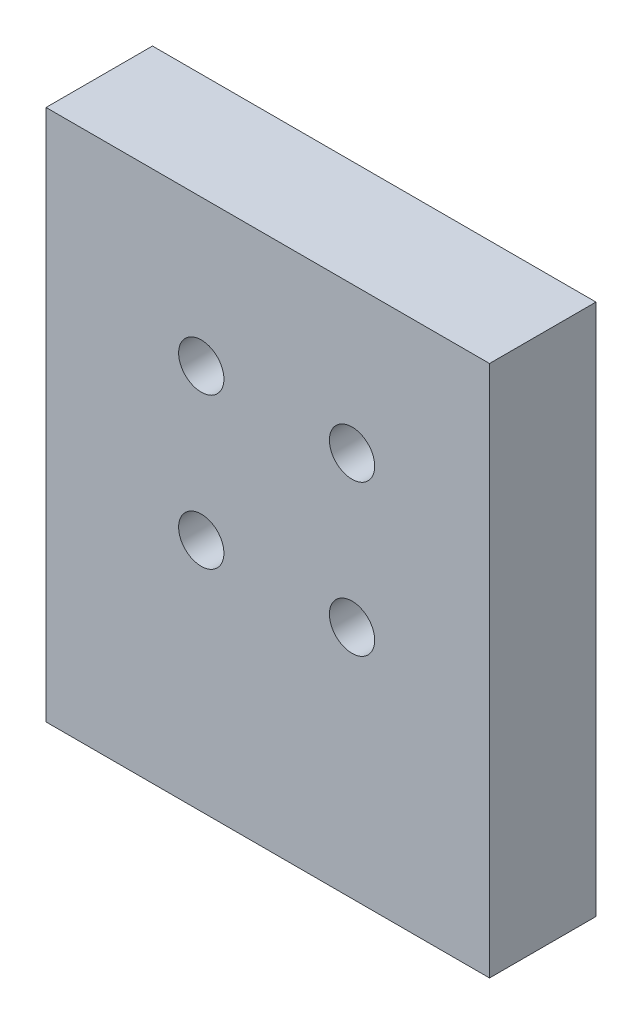
ISO-10303-21;
HEADER;
FILE_DESCRIPTION(('STEP AP214'),'2;1');
FILE_NAME('part.step','',(''),(''),'','','');
FILE_SCHEMA(('AUTOMOTIVE_DESIGN { 1 0 10303 214 1 1 1 1 }'));
ENDSEC;
DATA;
#1=APPLICATION_CONTEXT('core data for automotive mechanical design processes');
#2=APPLICATION_PROTOCOL_DEFINITION('international standard','automotive_design',2000,#1);
#3=PRODUCT_CONTEXT('',#1,'mechanical');
#4=PRODUCT('Part','Part','',(#3));
#5=PRODUCT_RELATED_PRODUCT_CATEGORY('part','',(#4));
#6=PRODUCT_DEFINITION_FORMATION('','',#4);
#7=PRODUCT_DEFINITION_CONTEXT('part definition',#1,'design');
#8=PRODUCT_DEFINITION('design','',#6,#7);
#9=PRODUCT_DEFINITION_SHAPE('','',#8);
#10=(LENGTH_UNIT() NAMED_UNIT(*) SI_UNIT(.MILLI.,.METRE.));
#11=(NAMED_UNIT(*) PLANE_ANGLE_UNIT() SI_UNIT($,.RADIAN.));
#12=(NAMED_UNIT(*) SI_UNIT($,.STERADIAN.) SOLID_ANGLE_UNIT());
#13=UNCERTAINTY_MEASURE_WITH_UNIT(LENGTH_MEASURE(1.E-05),#10,'distance_accuracy_value','');
#14=(GEOMETRIC_REPRESENTATION_CONTEXT(3) GLOBAL_UNCERTAINTY_ASSIGNED_CONTEXT((#13)) GLOBAL_UNIT_ASSIGNED_CONTEXT((#10,
#11,#12)) REPRESENTATION_CONTEXT('',''));
#15=CARTESIAN_POINT('',(0.,0.,0.));
#16=DIRECTION('',(0.,0.,1.));
#17=DIRECTION('',(1.,0.,0.));
#18=AXIS2_PLACEMENT_3D('',#15,#16,#17);
#19=CARTESIAN_POINT('',(25.,30.,-12.));
#20=DIRECTION('',(1.,0.,0.));
#21=DIRECTION('',(0.,1.,0.));
#22=AXIS2_PLACEMENT_3D('',#19,#20,#21);
#23=PLANE('',#22);
#24=DIRECTION('',(0.,-1.,0.));
#25=VECTOR('',#24,1.);
#26=CARTESIAN_POINT('',(25.,30.,0.));
#27=LINE('',#26,#25);
#28=CARTESIAN_POINT('',(25.,30.,0.));
#29=VERTEX_POINT('',#28);
#30=CARTESIAN_POINT('',(25.,-30.,0.));
#31=VERTEX_POINT('',#30);
#32=EDGE_CURVE('E146',#29,#31,#27,.T.);
#33=ORIENTED_EDGE('',*,*,#32,.T.);
#34=DIRECTION('',(0.,0.,1.));
#35=VECTOR('',#34,1.);
#36=CARTESIAN_POINT('',(25.,-30.,-12.));
#37=LINE('',#36,#35);
#38=CARTESIAN_POINT('',(25.,-30.,-12.));
#39=VERTEX_POINT('',#38);
#40=EDGE_CURVE('E154',#39,#31,#37,.T.);
#41=ORIENTED_EDGE('',*,*,#40,.F.);
#42=DIRECTION('',(0.,-1.,0.));
#43=VECTOR('',#42,1.);
#44=CARTESIAN_POINT('',(25.,30.,-12.));
#45=LINE('',#44,#43);
#46=CARTESIAN_POINT('',(25.,30.,-12.));
#47=VERTEX_POINT('',#46);
#48=EDGE_CURVE('E147',#47,#39,#45,.T.);
#49=ORIENTED_EDGE('',*,*,#48,.F.);
#50=DIRECTION('',(0.,0.,1.));
#51=VECTOR('',#50,1.);
#52=CARTESIAN_POINT('',(25.,30.,-12.));
#53=LINE('',#52,#51);
#54=EDGE_CURVE('E11',#47,#29,#53,.T.);
#55=ORIENTED_EDGE('',*,*,#54,.T.);
#56=EDGE_LOOP('',(#33,#41,#49,#55));
#57=FACE_BOUND('',#56,.T.);
#58=ADVANCED_FACE('F41',(#57),#23,.T.);
#59=CARTESIAN_POINT('',(25.,30.,-12.));
#60=DIRECTION('',(0.,-1.,0.));
#61=DIRECTION('',(1.,0.,0.));
#62=AXIS2_PLACEMENT_3D('',#59,#60,#61);
#63=PLANE('',#62);
#64=DIRECTION('',(-1.,0.,0.));
#65=VECTOR('',#64,1.);
#66=CARTESIAN_POINT('',(25.,30.,0.));
#67=LINE('',#66,#65);
#68=CARTESIAN_POINT('',(-25.,30.,0.));
#69=VERTEX_POINT('',#68);
#70=EDGE_CURVE('E83',#29,#69,#67,.T.);
#71=ORIENTED_EDGE('',*,*,#70,.F.);
#72=ORIENTED_EDGE('',*,*,#54,.F.);
#73=DIRECTION('',(-1.,0.,0.));
#74=VECTOR('',#73,1.);
#75=CARTESIAN_POINT('',(25.,30.,-12.));
#76=LINE('',#75,#74);
#77=CARTESIAN_POINT('',(-25.,30.,-12.));
#78=VERTEX_POINT('',#77);
#79=EDGE_CURVE('E59',#47,#78,#76,.T.);
#80=ORIENTED_EDGE('',*,*,#79,.T.);
#81=DIRECTION('',(0.,0.,1.));
#82=VECTOR('',#81,1.);
#83=CARTESIAN_POINT('',(-25.,30.,-12.));
#84=LINE('',#83,#82);
#85=EDGE_CURVE('E50',#78,#69,#84,.T.);
#86=ORIENTED_EDGE('',*,*,#85,.T.);
#87=EDGE_LOOP('',(#71,#72,#80,#86));
#88=FACE_BOUND('',#87,.T.);
#89=ADVANCED_FACE('F203',(#88),#63,.F.);
#90=CARTESIAN_POINT('',(-25.,30.,-12.));
#91=DIRECTION('',(1.,0.,0.));
#92=DIRECTION('',(0.,1.,0.));
#93=AXIS2_PLACEMENT_3D('',#90,#91,#92);
#94=PLANE('',#93);
#95=DIRECTION('',(0.,-1.,0.));
#96=VECTOR('',#95,1.);
#97=CARTESIAN_POINT('',(-25.,30.,0.));
#98=LINE('',#97,#96);
#99=CARTESIAN_POINT('',(-25.,-30.,0.));
#100=VERTEX_POINT('',#99);
#101=EDGE_CURVE('E77',#69,#100,#98,.T.);
#102=ORIENTED_EDGE('',*,*,#101,.F.);
#103=ORIENTED_EDGE('',*,*,#85,.F.);
#104=DIRECTION('',(0.,-1.,0.));
#105=VECTOR('',#104,1.);
#106=CARTESIAN_POINT('',(-25.,30.,-12.));
#107=LINE('',#106,#105);
#108=CARTESIAN_POINT('',(-25.,-30.,-12.));
#109=VERTEX_POINT('',#108);
#110=EDGE_CURVE('E150',#78,#109,#107,.T.);
#111=ORIENTED_EDGE('',*,*,#110,.T.);
#112=DIRECTION('',(0.,0.,1.));
#113=VECTOR('',#112,1.);
#114=CARTESIAN_POINT('',(-25.,-30.,-12.));
#115=LINE('',#114,#113);
#116=EDGE_CURVE('E162',#109,#100,#115,.T.);
#117=ORIENTED_EDGE('',*,*,#116,.T.);
#118=EDGE_LOOP('',(#102,#103,#111,#117));
#119=FACE_BOUND('',#118,.T.);
#120=ADVANCED_FACE('F190',(#119),#94,.F.);
#121=CARTESIAN_POINT('',(25.,-30.,-12.));
#122=DIRECTION('',(0.,-1.,0.));
#123=DIRECTION('',(1.,0.,0.));
#124=AXIS2_PLACEMENT_3D('',#121,#122,#123);
#125=PLANE('',#124);
#126=CARTESIAN_POINT('',(-15.,-30.,-6.));
#127=DIRECTION('',(0.,1.,0.));
#128=DIRECTION('',(0.,0.,1.));
#129=AXIS2_PLACEMENT_3D('',#126,#127,#128);
#130=CIRCLE('',#129,1.7272);
#131=CARTESIAN_POINT('',(-15.,-30.,-4.2728));
#132=VERTEX_POINT('',#131);
#133=EDGE_CURVE('E111',#132,#132,#130,.T.);
#134=ORIENTED_EDGE('',*,*,#133,.T.);
#135=EDGE_LOOP('',(#134));
#136=FACE_BOUND('',#135,.T.);
#137=CARTESIAN_POINT('',(0.,-30.,-6.));
#138=DIRECTION('',(0.,1.,0.));
#139=DIRECTION('',(0.,0.,1.));
#140=AXIS2_PLACEMENT_3D('',#137,#138,#139);
#141=CIRCLE('',#140,1.7272);
#142=CARTESIAN_POINT('',(0.,-30.,-4.2728));
#143=VERTEX_POINT('',#142);
#144=EDGE_CURVE('E110',#143,#143,#141,.T.);
#145=ORIENTED_EDGE('',*,*,#144,.T.);
#146=EDGE_LOOP('',(#145));
#147=FACE_BOUND('',#146,.T.);
#148=CARTESIAN_POINT('',(15.,-30.,-6.));
#149=DIRECTION('',(0.,1.,0.));
#150=DIRECTION('',(0.,0.,1.));
#151=AXIS2_PLACEMENT_3D('',#148,#149,#150);
#152=CIRCLE('',#151,1.7272);
#153=CARTESIAN_POINT('',(15.,-30.,-4.2728));
#154=VERTEX_POINT('',#153);
#155=EDGE_CURVE('E121',#154,#154,#152,.T.);
#156=ORIENTED_EDGE('',*,*,#155,.T.);
#157=EDGE_LOOP('',(#156));
#158=FACE_BOUND('',#157,.T.);
#159=DIRECTION('',(-1.,0.,0.));
#160=VECTOR('',#159,1.);
#161=CARTESIAN_POINT('',(25.,-30.,0.));
#162=LINE('',#161,#160);
#163=EDGE_CURVE('E157',#31,#100,#162,.T.);
#164=ORIENTED_EDGE('',*,*,#163,.T.);
#165=ORIENTED_EDGE('',*,*,#116,.F.);
#166=DIRECTION('',(-1.,0.,0.));
#167=VECTOR('',#166,1.);
#168=CARTESIAN_POINT('',(25.,-30.,-12.));
#169=LINE('',#168,#167);
#170=EDGE_CURVE('E90',#39,#109,#169,.T.);
#171=ORIENTED_EDGE('',*,*,#170,.F.);
#172=ORIENTED_EDGE('',*,*,#40,.T.);
#173=EDGE_LOOP('',(#164,#165,#171,#172));
#174=FACE_BOUND('',#173,.T.);
#175=ADVANCED_FACE('F181',(#136,#147,#158,#174),#125,.T.);
#176=CARTESIAN_POINT('',(0.,0.,-12.));
#177=DIRECTION('',(0.,0.,1.));
#178=DIRECTION('',(-1.,0.,0.));
#179=AXIS2_PLACEMENT_3D('',#176,#177,#178);
#180=PLANE('',#179);
#181=CARTESIAN_POINT('',(-7.5,13.5,-12.));
#182=DIRECTION('',(0.,0.,1.));
#183=DIRECTION('',(1.,0.,0.));
#184=AXIS2_PLACEMENT_3D('',#181,#182,#183);
#185=CIRCLE('',#184,2.5527);
#186=CARTESIAN_POINT('',(-4.9473,13.5,-12.));
#187=VERTEX_POINT('',#186);
#188=EDGE_CURVE('E127',#187,#187,#185,.T.);
#189=ORIENTED_EDGE('',*,*,#188,.T.);
#190=EDGE_LOOP('',(#189));
#191=FACE_BOUND('',#190,.T.);
#192=CARTESIAN_POINT('',(9.5,13.5,-12.));
#193=DIRECTION('',(0.,0.,1.));
#194=DIRECTION('',(1.,0.,0.));
#195=AXIS2_PLACEMENT_3D('',#192,#193,#194);
#196=CIRCLE('',#195,2.5527);
#197=CARTESIAN_POINT('',(12.0527,13.5,-12.));
#198=VERTEX_POINT('',#197);
#199=EDGE_CURVE('E130',#198,#198,#196,.T.);
#200=ORIENTED_EDGE('',*,*,#199,.T.);
#201=EDGE_LOOP('',(#200));
#202=FACE_BOUND('',#201,.T.);
#203=CARTESIAN_POINT('',(9.5,-3.49999999999999,-12.));
#204=DIRECTION('',(0.,0.,1.));
#205=DIRECTION('',(1.,0.,0.));
#206=AXIS2_PLACEMENT_3D('',#203,#204,#205);
#207=CIRCLE('',#206,2.5527);
#208=CARTESIAN_POINT('',(12.0527,-3.49999999999999,-12.));
#209=VERTEX_POINT('',#208);
#210=EDGE_CURVE('E136',#209,#209,#207,.T.);
#211=ORIENTED_EDGE('',*,*,#210,.T.);
#212=EDGE_LOOP('',(#211));
#213=FACE_BOUND('',#212,.T.);
#214=CARTESIAN_POINT('',(-7.5,-3.49999999999999,-12.));
#215=DIRECTION('',(0.,0.,1.));
#216=DIRECTION('',(1.,0.,0.));
#217=AXIS2_PLACEMENT_3D('',#214,#215,#216);
#218=CIRCLE('',#217,2.5527);
#219=CARTESIAN_POINT('',(-4.9473,-3.49999999999999,-12.));
#220=VERTEX_POINT('',#219);
#221=EDGE_CURVE('E140',#220,#220,#218,.T.);
#222=ORIENTED_EDGE('',*,*,#221,.T.);
#223=EDGE_LOOP('',(#222));
#224=FACE_BOUND('',#223,.T.);
#225=ORIENTED_EDGE('',*,*,#48,.T.);
#226=ORIENTED_EDGE('',*,*,#170,.T.);
#227=ORIENTED_EDGE('',*,*,#110,.F.);
#228=ORIENTED_EDGE('',*,*,#79,.F.);
#229=EDGE_LOOP('',(#225,#226,#227,#228));
#230=FACE_BOUND('',#229,.T.);
#231=ADVANCED_FACE('F178',(#191,#202,#213,#224,#230),#180,.F.);
#232=CARTESIAN_POINT('',(0.,0.,0.));
#233=DIRECTION('',(0.,0.,1.));
#234=DIRECTION('',(-1.,0.,0.));
#235=AXIS2_PLACEMENT_3D('',#232,#233,#234);
#236=PLANE('',#235);
#237=CARTESIAN_POINT('',(-7.5,13.5,0.));
#238=DIRECTION('',(0.,0.,-1.));
#239=DIRECTION('',(-1.,0.,0.));
#240=AXIS2_PLACEMENT_3D('',#237,#238,#239);
#241=CIRCLE('',#240,2.5527);
#242=CARTESIAN_POINT('',(-10.0527,13.5,0.));
#243=VERTEX_POINT('',#242);
#244=EDGE_CURVE('E44',#243,#243,#241,.T.);
#245=ORIENTED_EDGE('',*,*,#244,.T.);
#246=EDGE_LOOP('',(#245));
#247=FACE_BOUND('',#246,.T.);
#248=CARTESIAN_POINT('',(9.5,13.5,0.));
#249=DIRECTION('',(0.,0.,-1.));
#250=DIRECTION('',(-1.,0.,0.));
#251=AXIS2_PLACEMENT_3D('',#248,#249,#250);
#252=CIRCLE('',#251,2.5527);
#253=CARTESIAN_POINT('',(6.9473,13.5,0.));
#254=VERTEX_POINT('',#253);
#255=EDGE_CURVE('E133',#254,#254,#252,.T.);
#256=ORIENTED_EDGE('',*,*,#255,.T.);
#257=EDGE_LOOP('',(#256));
#258=FACE_BOUND('',#257,.T.);
#259=CARTESIAN_POINT('',(9.5,-3.49999999999999,0.));
#260=DIRECTION('',(0.,0.,-1.));
#261=DIRECTION('',(-1.,0.,0.));
#262=AXIS2_PLACEMENT_3D('',#259,#260,#261);
#263=CIRCLE('',#262,2.5527);
#264=CARTESIAN_POINT('',(6.9473,-3.49999999999999,0.));
#265=VERTEX_POINT('',#264);
#266=EDGE_CURVE('E139',#265,#265,#263,.T.);
#267=ORIENTED_EDGE('',*,*,#266,.T.);
#268=EDGE_LOOP('',(#267));
#269=FACE_BOUND('',#268,.T.);
#270=CARTESIAN_POINT('',(-7.5,-3.49999999999999,0.));
#271=DIRECTION('',(0.,0.,-1.));
#272=DIRECTION('',(-1.,0.,0.));
#273=AXIS2_PLACEMENT_3D('',#270,#271,#272);
#274=CIRCLE('',#273,2.5527);
#275=CARTESIAN_POINT('',(-10.0527,-3.49999999999999,0.));
#276=VERTEX_POINT('',#275);
#277=EDGE_CURVE('E143',#276,#276,#274,.T.);
#278=ORIENTED_EDGE('',*,*,#277,.T.);
#279=EDGE_LOOP('',(#278));
#280=FACE_BOUND('',#279,.T.);
#281=ORIENTED_EDGE('',*,*,#32,.F.);
#282=ORIENTED_EDGE('',*,*,#70,.T.);
#283=ORIENTED_EDGE('',*,*,#101,.T.);
#284=ORIENTED_EDGE('',*,*,#163,.F.);
#285=EDGE_LOOP('',(#281,#282,#283,#284));
#286=FACE_BOUND('',#285,.T.);
#287=ADVANCED_FACE('F167',(#247,#258,#269,#280,#286),#236,.T.);
#288=CARTESIAN_POINT('',(-7.5,-3.49999999999999,-12.));
#289=DIRECTION('',(0.,0.,-1.));
#290=DIRECTION('',(1.,0.,0.));
#291=AXIS2_PLACEMENT_3D('',#288,#289,#290);
#292=CYLINDRICAL_SURFACE('',#291,2.5527);
#293=ORIENTED_EDGE('',*,*,#277,.F.);
#294=EDGE_LOOP('',(#293));
#295=FACE_BOUND('',#294,.T.);
#296=ORIENTED_EDGE('',*,*,#221,.F.);
#297=EDGE_LOOP('',(#296));
#298=FACE_BOUND('',#297,.T.);
#299=ADVANCED_FACE('F174',(#295,#298),#292,.F.);
#300=CARTESIAN_POINT('',(9.5,-3.49999999999999,-12.));
#301=DIRECTION('',(0.,0.,-1.));
#302=DIRECTION('',(1.,0.,0.));
#303=AXIS2_PLACEMENT_3D('',#300,#301,#302);
#304=CYLINDRICAL_SURFACE('',#303,2.5527);
#305=ORIENTED_EDGE('',*,*,#266,.F.);
#306=EDGE_LOOP('',(#305));
#307=FACE_BOUND('',#306,.T.);
#308=ORIENTED_EDGE('',*,*,#210,.F.);
#309=EDGE_LOOP('',(#308));
#310=FACE_BOUND('',#309,.T.);
#311=ADVANCED_FACE('F170',(#307,#310),#304,.F.);
#312=CARTESIAN_POINT('',(9.5,13.5,-12.));
#313=DIRECTION('',(0.,0.,-1.));
#314=DIRECTION('',(1.,0.,0.));
#315=AXIS2_PLACEMENT_3D('',#312,#313,#314);
#316=CYLINDRICAL_SURFACE('',#315,2.5527);
#317=ORIENTED_EDGE('',*,*,#255,.F.);
#318=EDGE_LOOP('',(#317));
#319=FACE_BOUND('',#318,.T.);
#320=ORIENTED_EDGE('',*,*,#199,.F.);
#321=EDGE_LOOP('',(#320));
#322=FACE_BOUND('',#321,.T.);
#323=ADVANCED_FACE('F173',(#319,#322),#316,.F.);
#324=CARTESIAN_POINT('',(-7.5,13.5,-12.));
#325=DIRECTION('',(0.,0.,-1.));
#326=DIRECTION('',(1.,0.,0.));
#327=AXIS2_PLACEMENT_3D('',#324,#325,#326);
#328=CYLINDRICAL_SURFACE('',#327,2.5527);
#329=ORIENTED_EDGE('',*,*,#244,.F.);
#330=EDGE_LOOP('',(#329));
#331=FACE_BOUND('',#330,.T.);
#332=ORIENTED_EDGE('',*,*,#188,.F.);
#333=EDGE_LOOP('',(#332));
#334=FACE_BOUND('',#333,.T.);
#335=ADVANCED_FACE('F233',(#331,#334),#328,.F.);
#336=CARTESIAN_POINT('',(15.,-17.3,-6.));
#337=DIRECTION('',(0.,-1.,0.));
#338=DIRECTION('',(0.,0.,1.));
#339=AXIS2_PLACEMENT_3D('',#336,#337,#338);
#340=CONICAL_SURFACE('',#339,1.7272,1.02974425867665);
#341=CARTESIAN_POINT('',(15.,-16.2621935388156,-6.));
#342=VERTEX_POINT('',#341);
#343=VERTEX_LOOP('',#342);
#344=FACE_BOUND('',#343,.T.);
#345=CARTESIAN_POINT('',(15.,-17.3,-6.));
#346=DIRECTION('',(0.,1.,0.));
#347=DIRECTION('',(0.,0.,1.));
#348=AXIS2_PLACEMENT_3D('',#345,#346,#347);
#349=CIRCLE('',#348,1.7272);
#350=CARTESIAN_POINT('',(15.,-17.3,-4.2728));
#351=VERTEX_POINT('',#350);
#352=EDGE_CURVE('E124',#351,#351,#349,.T.);
#353=ORIENTED_EDGE('',*,*,#352,.F.);
#354=EDGE_LOOP('',(#353));
#355=FACE_BOUND('',#354,.T.);
#356=ADVANCED_FACE('F224',(#344,#355),#340,.F.);
#357=CARTESIAN_POINT('',(15.,-30.,-6.));
#358=DIRECTION('',(0.,-1.,0.));
#359=DIRECTION('',(0.,0.,1.));
#360=AXIS2_PLACEMENT_3D('',#357,#358,#359);
#361=CYLINDRICAL_SURFACE('',#360,1.7272);
#362=ORIENTED_EDGE('',*,*,#352,.T.);
#363=EDGE_LOOP('',(#362));
#364=FACE_BOUND('',#363,.T.);
#365=ORIENTED_EDGE('',*,*,#155,.F.);
#366=EDGE_LOOP('',(#365));
#367=FACE_BOUND('',#366,.T.);
#368=ADVANCED_FACE('F221',(#364,#367),#361,.F.);
#369=CARTESIAN_POINT('',(0.,-17.3,-6.));
#370=DIRECTION('',(0.,-1.,0.));
#371=DIRECTION('',(0.,0.,1.));
#372=AXIS2_PLACEMENT_3D('',#369,#370,#371);
#373=CONICAL_SURFACE('',#372,1.7272,1.02974425867665);
#374=CARTESIAN_POINT('',(0.,-16.2621935388156,-6.));
#375=VERTEX_POINT('',#374);
#376=VERTEX_LOOP('',#375);
#377=FACE_BOUND('',#376,.T.);
#378=CARTESIAN_POINT('',(0.,-17.3,-6.));
#379=DIRECTION('',(0.,1.,0.));
#380=DIRECTION('',(0.,0.,1.));
#381=AXIS2_PLACEMENT_3D('',#378,#379,#380);
#382=CIRCLE('',#381,1.7272);
#383=CARTESIAN_POINT('',(0.,-17.3,-4.2728));
#384=VERTEX_POINT('',#383);
#385=EDGE_CURVE('E114',#384,#384,#382,.T.);
#386=ORIENTED_EDGE('',*,*,#385,.F.);
#387=EDGE_LOOP('',(#386));
#388=FACE_BOUND('',#387,.T.);
#389=ADVANCED_FACE('F223',(#377,#388),#373,.F.);
#390=CARTESIAN_POINT('',(0.,-30.,-6.));
#391=DIRECTION('',(0.,-1.,0.));
#392=DIRECTION('',(0.,0.,1.));
#393=AXIS2_PLACEMENT_3D('',#390,#391,#392);
#394=CYLINDRICAL_SURFACE('',#393,1.7272);
#395=ORIENTED_EDGE('',*,*,#385,.T.);
#396=EDGE_LOOP('',(#395));
#397=FACE_BOUND('',#396,.T.);
#398=ORIENTED_EDGE('',*,*,#144,.F.);
#399=EDGE_LOOP('',(#398));
#400=FACE_BOUND('',#399,.T.);
#401=ADVANCED_FACE('F104',(#397,#400),#394,.F.);
#402=CARTESIAN_POINT('',(-15.,-17.3,-6.));
#403=DIRECTION('',(0.,-1.,0.));
#404=DIRECTION('',(0.,0.,1.));
#405=AXIS2_PLACEMENT_3D('',#402,#403,#404);
#406=CONICAL_SURFACE('',#405,1.7272,1.02974425867665);
#407=CARTESIAN_POINT('',(-15.,-16.2621935388156,-6.));
#408=VERTEX_POINT('',#407);
#409=VERTEX_LOOP('',#408);
#410=FACE_BOUND('',#409,.T.);
#411=CARTESIAN_POINT('',(-15.,-17.3,-6.));
#412=DIRECTION('',(0.,1.,0.));
#413=DIRECTION('',(0.,0.,1.));
#414=AXIS2_PLACEMENT_3D('',#411,#412,#413);
#415=CIRCLE('',#414,1.7272);
#416=CARTESIAN_POINT('',(-15.,-17.3,-4.2728));
#417=VERTEX_POINT('',#416);
#418=EDGE_CURVE('E108',#417,#417,#415,.T.);
#419=ORIENTED_EDGE('',*,*,#418,.F.);
#420=EDGE_LOOP('',(#419));
#421=FACE_BOUND('',#420,.T.);
#422=ADVANCED_FACE('F100',(#410,#421),#406,.F.);
#423=CARTESIAN_POINT('',(-15.,-30.,-6.));
#424=DIRECTION('',(0.,-1.,0.));
#425=DIRECTION('',(0.,0.,1.));
#426=AXIS2_PLACEMENT_3D('',#423,#424,#425);
#427=CYLINDRICAL_SURFACE('',#426,1.7272);
#428=ORIENTED_EDGE('',*,*,#418,.T.);
#429=EDGE_LOOP('',(#428));
#430=FACE_BOUND('',#429,.T.);
#431=ORIENTED_EDGE('',*,*,#133,.F.);
#432=EDGE_LOOP('',(#431));
#433=FACE_BOUND('',#432,.T.);
#434=ADVANCED_FACE('F103',(#430,#433),#427,.F.);
#435=CLOSED_SHELL('',(#58,#89,#120,#175,#231,#287,#299,#311,#323,#335,#356,#368,#389,#401,#422,#434));
#436=MANIFOLD_SOLID_BREP('B2',#435);
#437=ADVANCED_BREP_SHAPE_REPRESENTATION('',(#18,#436),#14);
#438=SHAPE_DEFINITION_REPRESENTATION(#9,#437);
ENDSEC;
END-ISO-10303-21;
